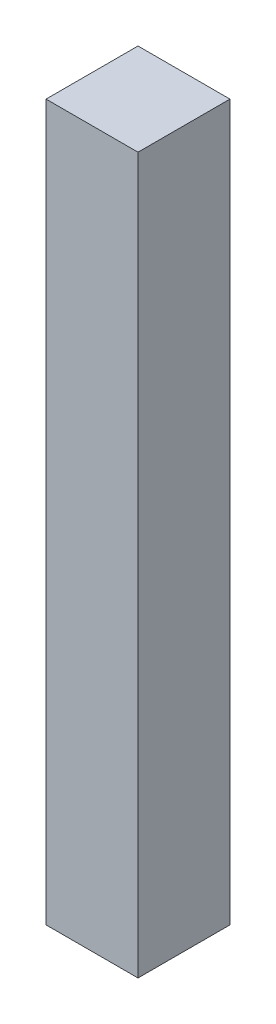
ISO-10303-21;
HEADER;
FILE_DESCRIPTION(('STEP AP214'),'2;1');
FILE_NAME('part.step','',(''),(''),'','','');
FILE_SCHEMA(('AUTOMOTIVE_DESIGN { 1 0 10303 214 1 1 1 1 }'));
ENDSEC;
DATA;
#1=APPLICATION_CONTEXT('core data for automotive mechanical design processes');
#2=APPLICATION_PROTOCOL_DEFINITION('international standard','automotive_design',2000,#1);
#3=PRODUCT_CONTEXT('',#1,'mechanical');
#4=PRODUCT('Part','Part','',(#3));
#5=PRODUCT_RELATED_PRODUCT_CATEGORY('part','',(#4));
#6=PRODUCT_DEFINITION_FORMATION('','',#4);
#7=PRODUCT_DEFINITION_CONTEXT('part definition',#1,'design');
#8=PRODUCT_DEFINITION('design','',#6,#7);
#9=PRODUCT_DEFINITION_SHAPE('','',#8);
#10=(LENGTH_UNIT() NAMED_UNIT(*) SI_UNIT(.MILLI.,.METRE.));
#11=(NAMED_UNIT(*) PLANE_ANGLE_UNIT() SI_UNIT($,.RADIAN.));
#12=(NAMED_UNIT(*) SI_UNIT($,.STERADIAN.) SOLID_ANGLE_UNIT());
#13=UNCERTAINTY_MEASURE_WITH_UNIT(LENGTH_MEASURE(1.E-05),#10,'distance_accuracy_value','');
#14=(GEOMETRIC_REPRESENTATION_CONTEXT(3) GLOBAL_UNCERTAINTY_ASSIGNED_CONTEXT((#13)) GLOBAL_UNIT_ASSIGNED_CONTEXT((#10,
#11,#12)) REPRESENTATION_CONTEXT('',''));
#15=CARTESIAN_POINT('',(0.,0.,0.));
#16=DIRECTION('',(0.,0.,1.));
#17=DIRECTION('',(1.,0.,0.));
#18=AXIS2_PLACEMENT_3D('',#15,#16,#17);
#19=CARTESIAN_POINT('',(16.1,15.,-3.64));
#20=DIRECTION('',(0.,0.,-1.));
#21=DIRECTION('',(0.,1.,0.));
#22=AXIS2_PLACEMENT_3D('',#19,#20,#21);
#23=PLANE('',#22);
#24=DIRECTION('',(1.,0.,0.));
#25=VECTOR('',#24,1.);
#26=CARTESIAN_POINT('',(16.1,11.1111111111111,-3.64));
#27=LINE('',#26,#25);
#28=CARTESIAN_POINT('',(17.6,11.1111111111111,-3.64));
#29=VERTEX_POINT('',#28);
#30=CARTESIAN_POINT('',(16.6,11.1111111111111,-3.64));
#31=VERTEX_POINT('',#30);
#32=EDGE_CURVE('E20',#29,#31,#27,.F.);
#33=ORIENTED_EDGE('',*,*,#32,.F.);
#34=DIRECTION('',(0.,1.,0.));
#35=VECTOR('',#34,1.);
#36=CARTESIAN_POINT('',(17.6,15.8612175402335,-3.64));
#37=LINE('',#36,#35);
#38=CARTESIAN_POINT('',(17.6,18.8888888888889,-3.64));
#39=VERTEX_POINT('',#38);
#40=EDGE_CURVE('E55',#29,#39,#37,.T.);
#41=ORIENTED_EDGE('',*,*,#40,.T.);
#42=DIRECTION('',(1.,0.,0.));
#43=VECTOR('',#42,1.);
#44=CARTESIAN_POINT('',(16.1,18.8888888888889,-3.64));
#45=LINE('',#44,#43);
#46=CARTESIAN_POINT('',(16.6,18.8888888888889,-3.64));
#47=VERTEX_POINT('',#46);
#48=EDGE_CURVE('E68',#47,#39,#45,.T.);
#49=ORIENTED_EDGE('',*,*,#48,.F.);
#50=DIRECTION('',(0.,1.,0.));
#51=VECTOR('',#50,1.);
#52=CARTESIAN_POINT('',(16.6,15.8612175402335,-3.64));
#53=LINE('',#52,#51);
#54=EDGE_CURVE('E61',#47,#31,#53,.F.);
#55=ORIENTED_EDGE('',*,*,#54,.T.);
#56=EDGE_LOOP('',(#33,#41,#49,#55));
#57=FACE_BOUND('',#56,.T.);
#58=ADVANCED_FACE('F17',(#57),#23,.F.);
#59=CARTESIAN_POINT('',(16.6,15.8612175402335,-4.63999999999999));
#60=DIRECTION('',(1.,0.,0.));
#61=DIRECTION('',(0.,0.,-1.));
#62=AXIS2_PLACEMENT_3D('',#59,#60,#61);
#63=PLANE('',#62);
#64=ORIENTED_EDGE('',*,*,#54,.F.);
#65=DIRECTION('',(0.,0.,1.));
#66=VECTOR('',#65,1.);
#67=CARTESIAN_POINT('',(16.6,18.8888888888889,-3.64));
#68=LINE('',#67,#66);
#69=CARTESIAN_POINT('',(16.6,18.8888888888889,-4.63999999999999));
#70=VERTEX_POINT('',#69);
#71=EDGE_CURVE('E64',#70,#47,#68,.T.);
#72=ORIENTED_EDGE('',*,*,#71,.F.);
#73=DIRECTION('',(0.,1.,0.));
#74=VECTOR('',#73,1.);
#75=CARTESIAN_POINT('',(16.6,15.,-4.64));
#76=LINE('',#75,#74);
#77=CARTESIAN_POINT('',(16.6,11.1111111111111,-4.63999999999998));
#78=VERTEX_POINT('',#77);
#79=EDGE_CURVE('E83',#78,#70,#76,.T.);
#80=ORIENTED_EDGE('',*,*,#79,.F.);
#81=DIRECTION('',(0.,0.,-1.));
#82=VECTOR('',#81,1.);
#83=CARTESIAN_POINT('',(16.6,11.1111111111111,-3.64));
#84=LINE('',#83,#82);
#85=EDGE_CURVE('E67',#31,#78,#84,.T.);
#86=ORIENTED_EDGE('',*,*,#85,.F.);
#87=EDGE_LOOP('',(#64,#72,#80,#86));
#88=FACE_BOUND('',#87,.T.);
#89=ADVANCED_FACE('F62',(#88),#63,.F.);
#90=CARTESIAN_POINT('',(16.1,18.8888888888889,-3.64));
#91=DIRECTION('',(0.,1.,0.));
#92=DIRECTION('',(0.,0.,1.));
#93=AXIS2_PLACEMENT_3D('',#90,#91,#92);
#94=PLANE('',#93);
#95=DIRECTION('',(0.,0.,1.));
#96=VECTOR('',#95,1.);
#97=CARTESIAN_POINT('',(17.6,18.8888888888889,-4.63999999999999));
#98=LINE('',#97,#96);
#99=CARTESIAN_POINT('',(17.6,18.8888888888889,-4.64));
#100=VERTEX_POINT('',#99);
#101=EDGE_CURVE('E79',#39,#100,#98,.F.);
#102=ORIENTED_EDGE('',*,*,#101,.T.);
#103=DIRECTION('',(1.,0.,0.));
#104=VECTOR('',#103,1.);
#105=CARTESIAN_POINT('',(16.1,18.8888888888889,-4.64));
#106=LINE('',#105,#104);
#107=EDGE_CURVE('E74',#70,#100,#106,.T.);
#108=ORIENTED_EDGE('',*,*,#107,.F.);
#109=ORIENTED_EDGE('',*,*,#71,.T.);
#110=ORIENTED_EDGE('',*,*,#48,.T.);
#111=EDGE_LOOP('',(#102,#108,#109,#110));
#112=FACE_BOUND('',#111,.T.);
#113=ADVANCED_FACE('F72',(#112),#94,.T.);
#114=CARTESIAN_POINT('',(17.6,15.8612175402335,-4.63999999999999));
#115=DIRECTION('',(-1.,0.,0.));
#116=DIRECTION('',(0.,0.,1.));
#117=AXIS2_PLACEMENT_3D('',#114,#115,#116);
#118=PLANE('',#117);
#119=DIRECTION('',(0.,1.,0.));
#120=VECTOR('',#119,1.);
#121=CARTESIAN_POINT('',(17.6,15.,-4.64));
#122=LINE('',#121,#120);
#123=CARTESIAN_POINT('',(17.6,11.1111111111111,-4.63999999999999));
#124=VERTEX_POINT('',#123);
#125=EDGE_CURVE('E26',#100,#124,#122,.F.);
#126=ORIENTED_EDGE('',*,*,#125,.F.);
#127=ORIENTED_EDGE('',*,*,#101,.F.);
#128=ORIENTED_EDGE('',*,*,#40,.F.);
#129=DIRECTION('',(0.,0.,-1.));
#130=VECTOR('',#129,1.);
#131=CARTESIAN_POINT('',(17.6,11.1111111111111,-3.64));
#132=LINE('',#131,#130);
#133=EDGE_CURVE('E35',#124,#29,#132,.F.);
#134=ORIENTED_EDGE('',*,*,#133,.F.);
#135=EDGE_LOOP('',(#126,#127,#128,#134));
#136=FACE_BOUND('',#135,.T.);
#137=ADVANCED_FACE('F89',(#136),#118,.F.);
#138=CARTESIAN_POINT('',(16.1,11.1111111111111,-3.64));
#139=DIRECTION('',(0.,-1.,0.));
#140=DIRECTION('',(0.,0.,-1.));
#141=AXIS2_PLACEMENT_3D('',#138,#139,#140);
#142=PLANE('',#141);
#143=ORIENTED_EDGE('',*,*,#133,.T.);
#144=ORIENTED_EDGE('',*,*,#32,.T.);
#145=ORIENTED_EDGE('',*,*,#85,.T.);
#146=DIRECTION('',(1.,0.,0.));
#147=VECTOR('',#146,1.);
#148=CARTESIAN_POINT('',(16.1,11.1111111111111,-4.64));
#149=LINE('',#148,#147);
#150=EDGE_CURVE('E11',#124,#78,#149,.F.);
#151=ORIENTED_EDGE('',*,*,#150,.F.);
#152=EDGE_LOOP('',(#143,#144,#145,#151));
#153=FACE_BOUND('',#152,.T.);
#154=ADVANCED_FACE('F91',(#153),#142,.T.);
#155=CARTESIAN_POINT('',(16.1,15.,-4.64));
#156=DIRECTION('',(0.,0.,-1.));
#157=DIRECTION('',(0.,1.,0.));
#158=AXIS2_PLACEMENT_3D('',#155,#156,#157);
#159=PLANE('',#158);
#160=ORIENTED_EDGE('',*,*,#125,.T.);
#161=ORIENTED_EDGE('',*,*,#150,.T.);
#162=ORIENTED_EDGE('',*,*,#79,.T.);
#163=ORIENTED_EDGE('',*,*,#107,.T.);
#164=EDGE_LOOP('',(#160,#161,#162,#163));
#165=FACE_BOUND('',#164,.T.);
#166=ADVANCED_FACE('F88',(#165),#159,.T.);
#167=CLOSED_SHELL('',(#58,#89,#113,#137,#154,#166));
#168=MANIFOLD_SOLID_BREP('B1',#167);
#169=ADVANCED_BREP_SHAPE_REPRESENTATION('',(#18,#168),#14);
#170=SHAPE_DEFINITION_REPRESENTATION(#9,#169);
ENDSEC;
END-ISO-10303-21;
